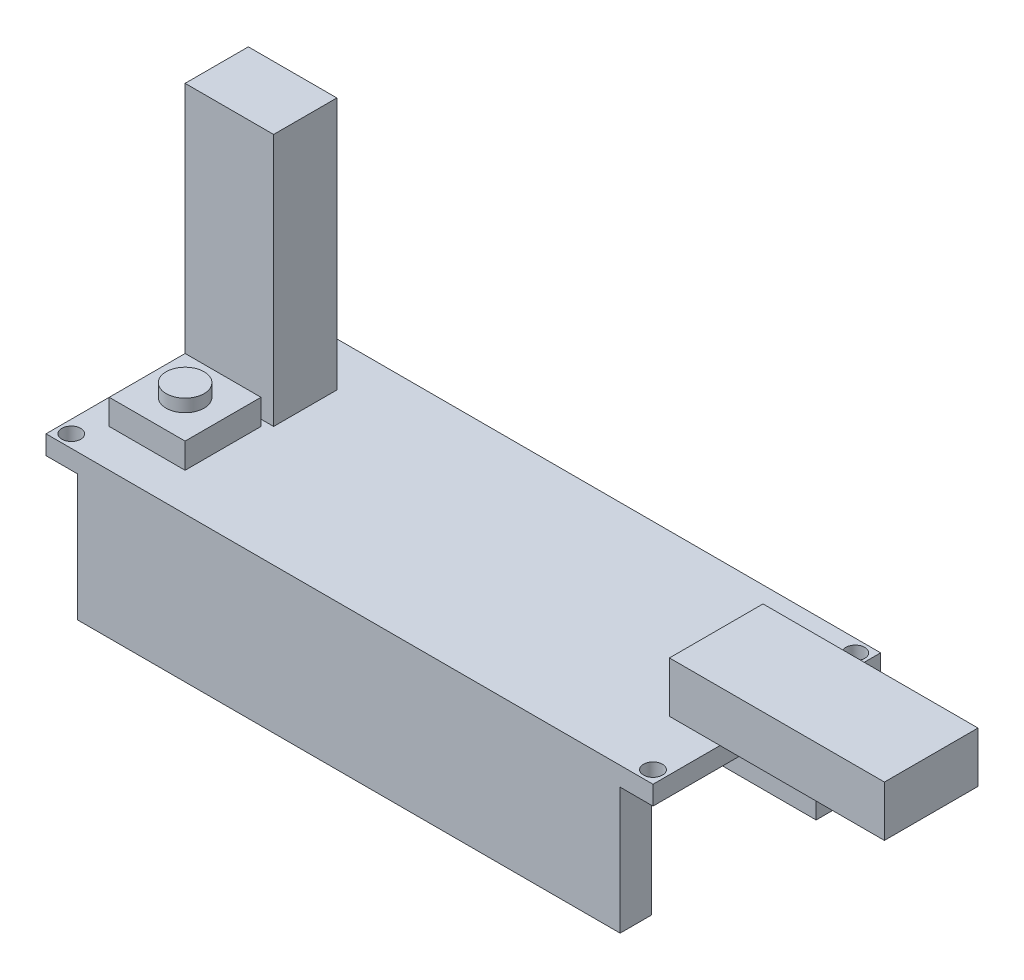
ISO-10303-21;
HEADER;
FILE_DESCRIPTION(('STEP AP214'),'2;1');
FILE_NAME('part.step','',(''),(''),'','','');
FILE_SCHEMA(('AUTOMOTIVE_DESIGN { 1 0 10303 214 1 1 1 1 }'));
ENDSEC;
DATA;
#1=APPLICATION_CONTEXT('core data for automotive mechanical design processes');
#2=APPLICATION_PROTOCOL_DEFINITION('international standard','automotive_design',2000,#1);
#3=PRODUCT_CONTEXT('',#1,'mechanical');
#4=PRODUCT('Part','Part','',(#3));
#5=PRODUCT_RELATED_PRODUCT_CATEGORY('part','',(#4));
#6=PRODUCT_DEFINITION_FORMATION('','',#4);
#7=PRODUCT_DEFINITION_CONTEXT('part definition',#1,'design');
#8=PRODUCT_DEFINITION('design','',#6,#7);
#9=PRODUCT_DEFINITION_SHAPE('','',#8);
#10=(LENGTH_UNIT() NAMED_UNIT(*) SI_UNIT(.MILLI.,.METRE.));
#11=(NAMED_UNIT(*) PLANE_ANGLE_UNIT() SI_UNIT($,.RADIAN.));
#12=(NAMED_UNIT(*) SI_UNIT($,.STERADIAN.) SOLID_ANGLE_UNIT());
#13=UNCERTAINTY_MEASURE_WITH_UNIT(LENGTH_MEASURE(1.E-05),#10,'distance_accuracy_value','');
#14=(GEOMETRIC_REPRESENTATION_CONTEXT(3) GLOBAL_UNCERTAINTY_ASSIGNED_CONTEXT((#13)) GLOBAL_UNIT_ASSIGNED_CONTEXT((#10,
#11,#12)) REPRESENTATION_CONTEXT('',''));
#15=CARTESIAN_POINT('',(0.,0.,0.));
#16=DIRECTION('',(0.,0.,1.));
#17=DIRECTION('',(1.,0.,0.));
#18=AXIS2_PLACEMENT_3D('',#15,#16,#17);
#19=CARTESIAN_POINT('',(0.,3.5,0.));
#20=DIRECTION('',(0.,1.,0.));
#21=DIRECTION('',(0.,0.,1.));
#22=AXIS2_PLACEMENT_3D('',#19,#20,#21);
#23=PLANE('',#22);
#24=DIRECTION('',(-1.,0.,0.));
#25=VECTOR('',#24,1.);
#26=CARTESIAN_POINT('',(0.,3.5,-2.99999999999999));
#27=LINE('',#26,#25);
#28=CARTESIAN_POINT('',(-40.,3.5,-2.99999999999999));
#29=VERTEX_POINT('',#28);
#30=CARTESIAN_POINT('',(-46.,3.5,-2.99999999999999));
#31=VERTEX_POINT('',#30);
#32=EDGE_CURVE('E221',#29,#31,#27,.T.);
#33=ORIENTED_EDGE('',*,*,#32,.F.);
#34=DIRECTION('',(0.,0.,1.));
#35=VECTOR('',#34,1.);
#36=CARTESIAN_POINT('',(-40.,3.5,0.));
#37=LINE('',#36,#35);
#38=CARTESIAN_POINT('',(-40.,3.5,-8.99999999999999));
#39=VERTEX_POINT('',#38);
#40=EDGE_CURVE('E236',#39,#29,#37,.T.);
#41=ORIENTED_EDGE('',*,*,#40,.F.);
#42=DIRECTION('',(1.,0.,0.));
#43=VECTOR('',#42,1.);
#44=CARTESIAN_POINT('',(0.,3.5,-8.99999999999999));
#45=LINE('',#44,#43);
#46=CARTESIAN_POINT('',(-46.,3.5,-8.99999999999999));
#47=VERTEX_POINT('',#46);
#48=EDGE_CURVE('E243',#47,#39,#45,.T.);
#49=ORIENTED_EDGE('',*,*,#48,.F.);
#50=DIRECTION('',(0.,0.,-1.));
#51=VECTOR('',#50,1.);
#52=CARTESIAN_POINT('',(-46.,3.5,0.));
#53=LINE('',#52,#51);
#54=EDGE_CURVE('E239',#31,#47,#53,.T.);
#55=ORIENTED_EDGE('',*,*,#54,.F.);
#56=EDGE_LOOP('',(#33,#41,#49,#55));
#57=FACE_BOUND('',#56,.T.);
#58=CARTESIAN_POINT('',(-43.,3.5,-5.99999999999999));
#59=DIRECTION('',(0.,1.,0.));
#60=DIRECTION('',(0.,0.,1.));
#61=AXIS2_PLACEMENT_3D('',#58,#59,#60);
#62=CIRCLE('',#61,1.5);
#63=CARTESIAN_POINT('',(-43.,3.5,-4.49999999999999));
#64=VERTEX_POINT('',#63);
#65=EDGE_CURVE('E362',#64,#64,#62,.T.);
#66=ORIENTED_EDGE('',*,*,#65,.F.);
#67=EDGE_LOOP('',(#66));
#68=FACE_BOUND('',#67,.T.);
#69=ADVANCED_FACE('F48',(#57,#68),#23,.T.);
#70=CARTESIAN_POINT('',(0.,1.5,0.));
#71=DIRECTION('',(0.,-1.,0.));
#72=DIRECTION('',(0.,0.,-1.));
#73=AXIS2_PLACEMENT_3D('',#70,#71,#72);
#74=PLANE('',#73);
#75=CARTESIAN_POINT('',(-1.,1.5,-17.));
#76=DIRECTION('',(0.,1.,0.));
#77=DIRECTION('',(0.,0.,-1.));
#78=AXIS2_PLACEMENT_3D('',#75,#76,#77);
#79=CIRCLE('',#78,0.749999999999999);
#80=CARTESIAN_POINT('',(-1.,1.5,-17.75));
#81=VERTEX_POINT('',#80);
#82=EDGE_CURVE('E379',#81,#81,#79,.T.);
#83=ORIENTED_EDGE('',*,*,#82,.F.);
#84=EDGE_LOOP('',(#83));
#85=FACE_BOUND('',#84,.T.);
#86=CARTESIAN_POINT('',(-1.,1.5,-0.999999999999994));
#87=DIRECTION('',(0.,1.,0.));
#88=DIRECTION('',(0.,0.,1.));
#89=AXIS2_PLACEMENT_3D('',#86,#87,#88);
#90=CIRCLE('',#89,0.749999999999999);
#91=CARTESIAN_POINT('',(-1.,1.5,-0.249999999999995));
#92=VERTEX_POINT('',#91);
#93=EDGE_CURVE('E369',#92,#92,#90,.T.);
#94=ORIENTED_EDGE('',*,*,#93,.F.);
#95=EDGE_LOOP('',(#94));
#96=FACE_BOUND('',#95,.T.);
#97=CARTESIAN_POINT('',(-47.,1.5,-0.999999999999994));
#98=DIRECTION('',(0.,1.,0.));
#99=DIRECTION('',(0.,0.,-1.));
#100=AXIS2_PLACEMENT_3D('',#97,#98,#99);
#101=CIRCLE('',#100,0.749999999999999);
#102=CARTESIAN_POINT('',(-47.,1.5,-1.74999999999999));
#103=VERTEX_POINT('',#102);
#104=EDGE_CURVE('E366',#103,#103,#101,.T.);
#105=ORIENTED_EDGE('',*,*,#104,.F.);
#106=EDGE_LOOP('',(#105));
#107=FACE_BOUND('',#106,.T.);
#108=CARTESIAN_POINT('',(-47.,1.5,-17.));
#109=DIRECTION('',(0.,1.,0.));
#110=DIRECTION('',(0.,0.,1.));
#111=AXIS2_PLACEMENT_3D('',#108,#109,#110);
#112=CIRCLE('',#111,0.749999999999999);
#113=CARTESIAN_POINT('',(-47.,1.5,-16.25));
#114=VERTEX_POINT('',#113);
#115=EDGE_CURVE('E363',#114,#114,#112,.T.);
#116=ORIENTED_EDGE('',*,*,#115,.F.);
#117=EDGE_LOOP('',(#116));
#118=FACE_BOUND('',#117,.T.);
#119=DIRECTION('',(0.,0.,1.));
#120=VECTOR('',#119,1.);
#121=CARTESIAN_POINT('',(-40.,1.5,0.));
#122=LINE('',#121,#120);
#123=CARTESIAN_POINT('',(-40.,1.5,-8.99999999999999));
#124=VERTEX_POINT('',#123);
#125=CARTESIAN_POINT('',(-40.,1.5,-2.99999999999999));
#126=VERTEX_POINT('',#125);
#127=EDGE_CURVE('E251',#124,#126,#122,.T.);
#128=ORIENTED_EDGE('',*,*,#127,.T.);
#129=DIRECTION('',(-1.,0.,0.));
#130=VECTOR('',#129,1.);
#131=CARTESIAN_POINT('',(0.,1.5,-2.99999999999999));
#132=LINE('',#131,#130);
#133=CARTESIAN_POINT('',(-46.,1.5,-2.99999999999999));
#134=VERTEX_POINT('',#133);
#135=EDGE_CURVE('E224',#126,#134,#132,.T.);
#136=ORIENTED_EDGE('',*,*,#135,.T.);
#137=DIRECTION('',(0.,0.,-1.));
#138=VECTOR('',#137,1.);
#139=CARTESIAN_POINT('',(-46.,1.5,0.));
#140=LINE('',#139,#138);
#141=CARTESIAN_POINT('',(-46.,1.5,-8.99999999999999));
#142=VERTEX_POINT('',#141);
#143=EDGE_CURVE('E240',#134,#142,#140,.T.);
#144=ORIENTED_EDGE('',*,*,#143,.T.);
#145=DIRECTION('',(1.,0.,0.));
#146=VECTOR('',#145,1.);
#147=CARTESIAN_POINT('',(0.,1.5,-8.99999999999999));
#148=LINE('',#147,#146);
#149=EDGE_CURVE('E66',#142,#124,#148,.T.);
#150=ORIENTED_EDGE('',*,*,#149,.T.);
#151=EDGE_LOOP('',(#128,#136,#144,#150));
#152=FACE_BOUND('',#151,.T.);
#153=DIRECTION('',(0.,0.,-1.));
#154=VECTOR('',#153,1.);
#155=CARTESIAN_POINT('',(-46.5,1.5,0.));
#156=LINE('',#155,#154);
#157=CARTESIAN_POINT('',(-46.5,1.5,-9.49999999999999));
#158=VERTEX_POINT('',#157);
#159=CARTESIAN_POINT('',(-46.5,1.5,-14.5));
#160=VERTEX_POINT('',#159);
#161=EDGE_CURVE('E277',#158,#160,#156,.T.);
#162=ORIENTED_EDGE('',*,*,#161,.T.);
#163=DIRECTION('',(1.,0.,0.));
#164=VECTOR('',#163,1.);
#165=CARTESIAN_POINT('',(0.,1.5,-14.5));
#166=LINE('',#165,#164);
#167=CARTESIAN_POINT('',(-39.5,1.5,-14.5));
#168=VERTEX_POINT('',#167);
#169=EDGE_CURVE('E229',#160,#168,#166,.T.);
#170=ORIENTED_EDGE('',*,*,#169,.T.);
#171=DIRECTION('',(0.,0.,1.));
#172=VECTOR('',#171,1.);
#173=CARTESIAN_POINT('',(-39.5,1.5,0.));
#174=LINE('',#173,#172);
#175=CARTESIAN_POINT('',(-39.5,1.5,-9.49999999999999));
#176=VERTEX_POINT('',#175);
#177=EDGE_CURVE('E265',#168,#176,#174,.T.);
#178=ORIENTED_EDGE('',*,*,#177,.T.);
#179=DIRECTION('',(-1.,0.,0.));
#180=VECTOR('',#179,1.);
#181=CARTESIAN_POINT('',(0.,1.5,-9.49999999999999));
#182=LINE('',#181,#180);
#183=EDGE_CURVE('E74',#176,#158,#182,.T.);
#184=ORIENTED_EDGE('',*,*,#183,.T.);
#185=EDGE_LOOP('',(#162,#170,#178,#184));
#186=FACE_BOUND('',#185,.T.);
#187=DIRECTION('',(1.,0.,0.));
#188=VECTOR('',#187,1.);
#189=CARTESIAN_POINT('',(0.,1.5,-5.3));
#190=LINE('',#189,#188);
#191=CARTESIAN_POINT('',(-4.,1.5,-5.3));
#192=VERTEX_POINT('',#191);
#193=CARTESIAN_POINT('',(0.,1.5,-5.3));
#194=VERTEX_POINT('',#193);
#195=EDGE_CURVE('E584',#192,#194,#190,.T.);
#196=ORIENTED_EDGE('',*,*,#195,.F.);
#197=DIRECTION('',(0.,0.,1.));
#198=VECTOR('',#197,1.);
#199=CARTESIAN_POINT('',(-4.,1.5,0.));
#200=LINE('',#199,#198);
#201=CARTESIAN_POINT('',(-4.,1.5,-12.7));
#202=VERTEX_POINT('',#201);
#203=EDGE_CURVE('E589',#202,#192,#200,.T.);
#204=ORIENTED_EDGE('',*,*,#203,.F.);
#205=DIRECTION('',(-1.,0.,0.));
#206=VECTOR('',#205,1.);
#207=CARTESIAN_POINT('',(0.,1.5,-12.7));
#208=LINE('',#207,#206);
#209=CARTESIAN_POINT('',(0.,1.5,-12.7));
#210=VERTEX_POINT('',#209);
#211=EDGE_CURVE('E12',#210,#202,#208,.T.);
#212=ORIENTED_EDGE('',*,*,#211,.F.);
#213=DIRECTION('',(0.,0.,-1.));
#214=VECTOR('',#213,1.);
#215=CARTESIAN_POINT('',(0.,1.5,-18.));
#216=LINE('',#215,#214);
#217=CARTESIAN_POINT('',(0.,1.5,-18.));
#218=VERTEX_POINT('',#217);
#219=EDGE_CURVE('E551',#210,#218,#216,.T.);
#220=ORIENTED_EDGE('',*,*,#219,.T.);
#221=DIRECTION('',(-1.,0.,0.));
#222=VECTOR('',#221,1.);
#223=CARTESIAN_POINT('',(-48.,1.5,-18.));
#224=LINE('',#223,#222);
#225=CARTESIAN_POINT('',(-48.,1.5,-18.));
#226=VERTEX_POINT('',#225);
#227=EDGE_CURVE('E572',#218,#226,#224,.T.);
#228=ORIENTED_EDGE('',*,*,#227,.T.);
#229=DIRECTION('',(0.,0.,1.));
#230=VECTOR('',#229,1.);
#231=CARTESIAN_POINT('',(-48.,1.5,0.));
#232=LINE('',#231,#230);
#233=CARTESIAN_POINT('',(-48.,1.5,0.));
#234=VERTEX_POINT('',#233);
#235=EDGE_CURVE('E571',#226,#234,#232,.T.);
#236=ORIENTED_EDGE('',*,*,#235,.T.);
#237=DIRECTION('',(1.,0.,0.));
#238=VECTOR('',#237,1.);
#239=CARTESIAN_POINT('',(0.,1.5,0.));
#240=LINE('',#239,#238);
#241=CARTESIAN_POINT('',(0.,1.5,0.));
#242=VERTEX_POINT('',#241);
#243=EDGE_CURVE('E535',#234,#242,#240,.T.);
#244=ORIENTED_EDGE('',*,*,#243,.T.);
#245=EDGE_CURVE('E556',#242,#194,#216,.T.);
#246=ORIENTED_EDGE('',*,*,#245,.T.);
#247=EDGE_LOOP('',(#196,#204,#212,#220,#228,#236,#244,#246));
#248=FACE_BOUND('',#247,.T.);
#249=ADVANCED_FACE('F391',(#85,#96,#107,#118,#152,#186,#248),#74,.F.);
#250=CARTESIAN_POINT('',(0.,1.5,-18.));
#251=DIRECTION('',(-1.,0.,0.));
#252=DIRECTION('',(0.,0.,1.));
#253=AXIS2_PLACEMENT_3D('',#250,#251,#252);
#254=PLANE('',#253);
#255=DIRECTION('',(0.,0.,-1.));
#256=VECTOR('',#255,1.);
#257=CARTESIAN_POINT('',(0.,0.,-18.));
#258=LINE('',#257,#256);
#259=CARTESIAN_POINT('',(0.,0.,0.));
#260=VERTEX_POINT('',#259);
#261=CARTESIAN_POINT('',(0.,0.,-18.));
#262=VERTEX_POINT('',#261);
#263=EDGE_CURVE('E527',#260,#262,#258,.T.);
#264=ORIENTED_EDGE('',*,*,#263,.T.);
#265=DIRECTION('',(0.,-1.,0.));
#266=VECTOR('',#265,1.);
#267=CARTESIAN_POINT('',(0.,1.5,-18.));
#268=LINE('',#267,#266);
#269=EDGE_CURVE('E57',#218,#262,#268,.T.);
#270=ORIENTED_EDGE('',*,*,#269,.F.);
#271=ORIENTED_EDGE('',*,*,#219,.F.);
#272=EDGE_CURVE('E554',#194,#210,#216,.T.);
#273=ORIENTED_EDGE('',*,*,#272,.F.);
#274=ORIENTED_EDGE('',*,*,#245,.F.);
#275=DIRECTION('',(0.,-1.,0.));
#276=VECTOR('',#275,1.);
#277=CARTESIAN_POINT('',(0.,1.5,0.));
#278=LINE('',#277,#276);
#279=EDGE_CURVE('E548',#242,#260,#278,.T.);
#280=ORIENTED_EDGE('',*,*,#279,.T.);
#281=EDGE_LOOP('',(#264,#270,#271,#273,#274,#280));
#282=FACE_BOUND('',#281,.T.);
#283=ADVANCED_FACE('F50',(#282),#254,.F.);
#284=CARTESIAN_POINT('',(-48.,1.5,-18.));
#285=DIRECTION('',(0.,0.,1.));
#286=DIRECTION('',(1.,0.,0.));
#287=AXIS2_PLACEMENT_3D('',#284,#285,#286);
#288=PLANE('',#287);
#289=DIRECTION('',(-1.,0.,0.));
#290=VECTOR('',#289,1.);
#291=CARTESIAN_POINT('',(-48.,0.,-18.));
#292=LINE('',#291,#290);
#293=CARTESIAN_POINT('',(-2.6,0.,-18.));
#294=VERTEX_POINT('',#293);
#295=EDGE_CURVE('E508',#262,#294,#292,.T.);
#296=ORIENTED_EDGE('',*,*,#295,.T.);
#297=DIRECTION('',(0.,1.,0.));
#298=VECTOR('',#297,1.);
#299=CARTESIAN_POINT('',(-2.6,-10.,-18.));
#300=LINE('',#299,#298);
#301=CARTESIAN_POINT('',(-2.6,-10.,-18.));
#302=VERTEX_POINT('',#301);
#303=EDGE_CURVE('E348',#302,#294,#300,.T.);
#304=ORIENTED_EDGE('',*,*,#303,.F.);
#305=DIRECTION('',(1.,0.,0.));
#306=VECTOR('',#305,1.);
#307=CARTESIAN_POINT('',(0.,-10.,-18.));
#308=LINE('',#307,#306);
#309=CARTESIAN_POINT('',(-45.5,-10.,-18.));
#310=VERTEX_POINT('',#309);
#311=EDGE_CURVE('E326',#310,#302,#308,.T.);
#312=ORIENTED_EDGE('',*,*,#311,.F.);
#313=DIRECTION('',(0.,1.,0.));
#314=VECTOR('',#313,1.);
#315=CARTESIAN_POINT('',(-45.5,-10.,-18.));
#316=LINE('',#315,#314);
#317=CARTESIAN_POINT('',(-45.5,0.,-18.));
#318=VERTEX_POINT('',#317);
#319=EDGE_CURVE('E344',#310,#318,#316,.T.);
#320=ORIENTED_EDGE('',*,*,#319,.T.);
#321=CARTESIAN_POINT('',(-48.,0.,-18.));
#322=VERTEX_POINT('',#321);
#323=EDGE_CURVE('E341',#318,#322,#292,.T.);
#324=ORIENTED_EDGE('',*,*,#323,.T.);
#325=DIRECTION('',(0.,-1.,0.));
#326=VECTOR('',#325,1.);
#327=CARTESIAN_POINT('',(-48.,1.5,-18.));
#328=LINE('',#327,#326);
#329=EDGE_CURVE('E543',#226,#322,#328,.T.);
#330=ORIENTED_EDGE('',*,*,#329,.F.);
#331=ORIENTED_EDGE('',*,*,#227,.F.);
#332=ORIENTED_EDGE('',*,*,#269,.T.);
#333=EDGE_LOOP('',(#296,#304,#312,#320,#324,#330,#331,#332));
#334=FACE_BOUND('',#333,.T.);
#335=ADVANCED_FACE('F497',(#334),#288,.F.);
#336=CARTESIAN_POINT('',(-48.,1.5,0.));
#337=DIRECTION('',(1.,0.,0.));
#338=DIRECTION('',(0.,0.,-1.));
#339=AXIS2_PLACEMENT_3D('',#336,#337,#338);
#340=PLANE('',#339);
#341=DIRECTION('',(0.,0.,1.));
#342=VECTOR('',#341,1.);
#343=CARTESIAN_POINT('',(-48.,0.,0.));
#344=LINE('',#343,#342);
#345=CARTESIAN_POINT('',(-48.,0.,0.));
#346=VERTEX_POINT('',#345);
#347=EDGE_CURVE('E516',#322,#346,#344,.T.);
#348=ORIENTED_EDGE('',*,*,#347,.T.);
#349=DIRECTION('',(0.,-1.,0.));
#350=VECTOR('',#349,1.);
#351=CARTESIAN_POINT('',(-48.,1.5,0.));
#352=LINE('',#351,#350);
#353=EDGE_CURVE('E545',#234,#346,#352,.T.);
#354=ORIENTED_EDGE('',*,*,#353,.F.);
#355=ORIENTED_EDGE('',*,*,#235,.F.);
#356=ORIENTED_EDGE('',*,*,#329,.T.);
#357=EDGE_LOOP('',(#348,#354,#355,#356));
#358=FACE_BOUND('',#357,.T.);
#359=ADVANCED_FACE('F494',(#358),#340,.F.);
#360=CARTESIAN_POINT('',(0.,1.5,0.));
#361=DIRECTION('',(0.,0.,-1.));
#362=DIRECTION('',(-1.,0.,0.));
#363=AXIS2_PLACEMENT_3D('',#360,#361,#362);
#364=PLANE('',#363);
#365=DIRECTION('',(1.,0.,0.));
#366=VECTOR('',#365,1.);
#367=CARTESIAN_POINT('',(0.,0.,0.));
#368=LINE('',#367,#366);
#369=CARTESIAN_POINT('',(-45.5,0.,0.));
#370=VERTEX_POINT('',#369);
#371=EDGE_CURVE('E549',#346,#370,#368,.T.);
#372=ORIENTED_EDGE('',*,*,#371,.T.);
#373=DIRECTION('',(0.,1.,0.));
#374=VECTOR('',#373,1.);
#375=CARTESIAN_POINT('',(-45.5,-10.,0.));
#376=LINE('',#375,#374);
#377=CARTESIAN_POINT('',(-45.5,-10.,0.));
#378=VERTEX_POINT('',#377);
#379=EDGE_CURVE('E313',#378,#370,#376,.T.);
#380=ORIENTED_EDGE('',*,*,#379,.F.);
#381=DIRECTION('',(-1.,0.,0.));
#382=VECTOR('',#381,1.);
#383=CARTESIAN_POINT('',(0.,-10.,0.));
#384=LINE('',#383,#382);
#385=CARTESIAN_POINT('',(-2.6,-10.,0.));
#386=VERTEX_POINT('',#385);
#387=EDGE_CURVE('E294',#386,#378,#384,.T.);
#388=ORIENTED_EDGE('',*,*,#387,.F.);
#389=DIRECTION('',(0.,1.,0.));
#390=VECTOR('',#389,1.);
#391=CARTESIAN_POINT('',(-2.6,-10.,0.));
#392=LINE('',#391,#390);
#393=CARTESIAN_POINT('',(-2.6,0.,0.));
#394=VERTEX_POINT('',#393);
#395=EDGE_CURVE('E316',#386,#394,#392,.T.);
#396=ORIENTED_EDGE('',*,*,#395,.T.);
#397=EDGE_CURVE('E552',#394,#260,#368,.T.);
#398=ORIENTED_EDGE('',*,*,#397,.T.);
#399=ORIENTED_EDGE('',*,*,#279,.F.);
#400=ORIENTED_EDGE('',*,*,#243,.F.);
#401=ORIENTED_EDGE('',*,*,#353,.T.);
#402=EDGE_LOOP('',(#372,#380,#388,#396,#398,#399,#400,#401));
#403=FACE_BOUND('',#402,.T.);
#404=ADVANCED_FACE('F490',(#403),#364,.F.);
#405=CARTESIAN_POINT('',(0.,0.,0.));
#406=DIRECTION('',(0.,-1.,0.));
#407=DIRECTION('',(0.,0.,-1.));
#408=AXIS2_PLACEMENT_3D('',#405,#406,#407);
#409=PLANE('',#408);
#410=CARTESIAN_POINT('',(-1.,0.,-17.));
#411=DIRECTION('',(0.,-1.,0.));
#412=DIRECTION('',(0.,0.,-1.));
#413=AXIS2_PLACEMENT_3D('',#410,#411,#412);
#414=CIRCLE('',#413,0.749999999999999);
#415=CARTESIAN_POINT('',(-1.,0.,-17.75));
#416=VERTEX_POINT('',#415);
#417=EDGE_CURVE('E52',#416,#416,#414,.T.);
#418=ORIENTED_EDGE('',*,*,#417,.F.);
#419=EDGE_LOOP('',(#418));
#420=FACE_BOUND('',#419,.T.);
#421=CARTESIAN_POINT('',(-1.,0.,-0.999999999999994));
#422=DIRECTION('',(0.,-1.,0.));
#423=DIRECTION('',(0.,0.,-1.));
#424=AXIS2_PLACEMENT_3D('',#421,#422,#423);
#425=CIRCLE('',#424,0.749999999999999);
#426=CARTESIAN_POINT('',(-1.,0.,-1.74999999999999));
#427=VERTEX_POINT('',#426);
#428=EDGE_CURVE('E367',#427,#427,#425,.T.);
#429=ORIENTED_EDGE('',*,*,#428,.F.);
#430=EDGE_LOOP('',(#429));
#431=FACE_BOUND('',#430,.T.);
#432=CARTESIAN_POINT('',(-47.,0.,-0.999999999999994));
#433=DIRECTION('',(0.,-1.,0.));
#434=DIRECTION('',(0.,0.,-1.));
#435=AXIS2_PLACEMENT_3D('',#432,#433,#434);
#436=CIRCLE('',#435,0.749999999999999);
#437=CARTESIAN_POINT('',(-47.,0.,-1.74999999999999));
#438=VERTEX_POINT('',#437);
#439=EDGE_CURVE('E364',#438,#438,#436,.T.);
#440=ORIENTED_EDGE('',*,*,#439,.F.);
#441=EDGE_LOOP('',(#440));
#442=FACE_BOUND('',#441,.T.);
#443=CARTESIAN_POINT('',(-47.,0.,-17.));
#444=DIRECTION('',(0.,-1.,0.));
#445=DIRECTION('',(0.,0.,-1.));
#446=AXIS2_PLACEMENT_3D('',#443,#444,#445);
#447=CIRCLE('',#446,0.749999999999999);
#448=CARTESIAN_POINT('',(-47.,0.,-17.75));
#449=VERTEX_POINT('',#448);
#450=EDGE_CURVE('E359',#449,#449,#447,.T.);
#451=ORIENTED_EDGE('',*,*,#450,.F.);
#452=EDGE_LOOP('',(#451));
#453=FACE_BOUND('',#452,.T.);
#454=DIRECTION('',(0.,0.,-1.));
#455=VECTOR('',#454,1.);
#456=CARTESIAN_POINT('',(-2.6,0.,0.));
#457=LINE('',#456,#455);
#458=CARTESIAN_POINT('',(-2.6,0.,-2.5));
#459=VERTEX_POINT('',#458);
#460=EDGE_CURVE('E290',#394,#459,#457,.T.);
#461=ORIENTED_EDGE('',*,*,#460,.T.);
#462=DIRECTION('',(-1.,0.,0.));
#463=VECTOR('',#462,1.);
#464=CARTESIAN_POINT('',(0.,0.,-2.5));
#465=LINE('',#464,#463);
#466=CARTESIAN_POINT('',(-45.5,0.,-2.49999999999999));
#467=VERTEX_POINT('',#466);
#468=EDGE_CURVE('E295',#459,#467,#465,.T.);
#469=ORIENTED_EDGE('',*,*,#468,.T.);
#470=DIRECTION('',(0.,0.,1.));
#471=VECTOR('',#470,1.);
#472=CARTESIAN_POINT('',(-45.5,0.,0.));
#473=LINE('',#472,#471);
#474=EDGE_CURVE('E305',#467,#370,#473,.T.);
#475=ORIENTED_EDGE('',*,*,#474,.T.);
#476=ORIENTED_EDGE('',*,*,#371,.F.);
#477=ORIENTED_EDGE('',*,*,#347,.F.);
#478=ORIENTED_EDGE('',*,*,#323,.F.);
#479=DIRECTION('',(0.,0.,-1.));
#480=VECTOR('',#479,1.);
#481=CARTESIAN_POINT('',(-45.5,0.,0.));
#482=LINE('',#481,#480);
#483=CARTESIAN_POINT('',(-45.5,0.,-15.5));
#484=VERTEX_POINT('',#483);
#485=EDGE_CURVE('E333',#484,#318,#482,.T.);
#486=ORIENTED_EDGE('',*,*,#485,.F.);
#487=DIRECTION('',(-1.,0.,0.));
#488=VECTOR('',#487,1.);
#489=CARTESIAN_POINT('',(0.,0.,-15.5));
#490=LINE('',#489,#488);
#491=CARTESIAN_POINT('',(-2.6,0.,-15.5));
#492=VERTEX_POINT('',#491);
#493=EDGE_CURVE('E319',#492,#484,#490,.T.);
#494=ORIENTED_EDGE('',*,*,#493,.F.);
#495=DIRECTION('',(0.,0.,1.));
#496=VECTOR('',#495,1.);
#497=CARTESIAN_POINT('',(-2.6,0.,0.));
#498=LINE('',#497,#496);
#499=EDGE_CURVE('E324',#294,#492,#498,.T.);
#500=ORIENTED_EDGE('',*,*,#499,.F.);
#501=ORIENTED_EDGE('',*,*,#295,.F.);
#502=ORIENTED_EDGE('',*,*,#263,.F.);
#503=ORIENTED_EDGE('',*,*,#397,.F.);
#504=EDGE_LOOP('',(#461,#469,#475,#476,#477,#478,#486,#494,#500,#501,#502,#503));
#505=FACE_BOUND('',#504,.T.);
#506=ADVANCED_FACE('F472',(#420,#431,#442,#453,#505),#409,.T.);
#507=CARTESIAN_POINT('',(0.,1.5,0.));
#508=DIRECTION('',(0.,1.,0.));
#509=DIRECTION('',(0.,0.,1.));
#510=AXIS2_PLACEMENT_3D('',#507,#508,#509);
#511=PLANE('',#510);
#512=CARTESIAN_POINT('',(13.,1.5,-5.3));
#513=VERTEX_POINT('',#512);
#514=EDGE_CURVE('E588',#194,#513,#190,.T.);
#515=ORIENTED_EDGE('',*,*,#514,.F.);
#516=ORIENTED_EDGE('',*,*,#272,.T.);
#517=CARTESIAN_POINT('',(13.,1.5,-12.7));
#518=VERTEX_POINT('',#517);
#519=EDGE_CURVE('E59',#518,#210,#208,.T.);
#520=ORIENTED_EDGE('',*,*,#519,.F.);
#521=DIRECTION('',(0.,0.,-1.));
#522=VECTOR('',#521,1.);
#523=CARTESIAN_POINT('',(13.,1.5,0.));
#524=LINE('',#523,#522);
#525=EDGE_CURVE('E593',#513,#518,#524,.T.);
#526=ORIENTED_EDGE('',*,*,#525,.F.);
#527=EDGE_LOOP('',(#515,#516,#520,#526));
#528=FACE_BOUND('',#527,.T.);
#529=ADVANCED_FACE('F468',(#528),#511,.F.);
#530=CARTESIAN_POINT('',(13.,5.5,0.));
#531=DIRECTION('',(-1.,0.,0.));
#532=DIRECTION('',(0.,0.,1.));
#533=AXIS2_PLACEMENT_3D('',#530,#531,#532);
#534=PLANE('',#533);
#535=ORIENTED_EDGE('',*,*,#525,.T.);
#536=DIRECTION('',(0.,-1.,0.));
#537=VECTOR('',#536,1.);
#538=CARTESIAN_POINT('',(13.,5.5,-12.7));
#539=LINE('',#538,#537);
#540=CARTESIAN_POINT('',(13.,5.5,-12.7));
#541=VERTEX_POINT('',#540);
#542=EDGE_CURVE('E528',#541,#518,#539,.T.);
#543=ORIENTED_EDGE('',*,*,#542,.F.);
#544=DIRECTION('',(0.,0.,-1.));
#545=VECTOR('',#544,1.);
#546=CARTESIAN_POINT('',(13.,5.5,0.));
#547=LINE('',#546,#545);
#548=CARTESIAN_POINT('',(13.,5.5,-5.3));
#549=VERTEX_POINT('',#548);
#550=EDGE_CURVE('E587',#549,#541,#547,.T.);
#551=ORIENTED_EDGE('',*,*,#550,.F.);
#552=DIRECTION('',(0.,-1.,0.));
#553=VECTOR('',#552,1.);
#554=CARTESIAN_POINT('',(13.,5.5,-5.3));
#555=LINE('',#554,#553);
#556=EDGE_CURVE('E580',#549,#513,#555,.T.);
#557=ORIENTED_EDGE('',*,*,#556,.T.);
#558=EDGE_LOOP('',(#535,#543,#551,#557));
#559=FACE_BOUND('',#558,.T.);
#560=ADVANCED_FACE('F471',(#559),#534,.F.);
#561=CARTESIAN_POINT('',(0.,5.5,-12.7));
#562=DIRECTION('',(0.,0.,1.));
#563=DIRECTION('',(1.,0.,0.));
#564=AXIS2_PLACEMENT_3D('',#561,#562,#563);
#565=PLANE('',#564);
#566=ORIENTED_EDGE('',*,*,#519,.T.);
#567=ORIENTED_EDGE('',*,*,#211,.T.);
#568=DIRECTION('',(0.,-1.,0.));
#569=VECTOR('',#568,1.);
#570=CARTESIAN_POINT('',(-4.,5.5,-12.7));
#571=LINE('',#570,#569);
#572=CARTESIAN_POINT('',(-4.,5.5,-12.7));
#573=VERTEX_POINT('',#572);
#574=EDGE_CURVE('E532',#573,#202,#571,.T.);
#575=ORIENTED_EDGE('',*,*,#574,.F.);
#576=DIRECTION('',(-1.,0.,0.));
#577=VECTOR('',#576,1.);
#578=CARTESIAN_POINT('',(0.,5.5,-12.7));
#579=LINE('',#578,#577);
#580=EDGE_CURVE('E599',#541,#573,#579,.T.);
#581=ORIENTED_EDGE('',*,*,#580,.F.);
#582=ORIENTED_EDGE('',*,*,#542,.T.);
#583=EDGE_LOOP('',(#566,#567,#575,#581,#582));
#584=FACE_BOUND('',#583,.T.);
#585=ADVANCED_FACE('F480',(#584),#565,.F.);
#586=CARTESIAN_POINT('',(-4.,5.5,0.));
#587=DIRECTION('',(1.,0.,0.));
#588=DIRECTION('',(0.,0.,-1.));
#589=AXIS2_PLACEMENT_3D('',#586,#587,#588);
#590=PLANE('',#589);
#591=ORIENTED_EDGE('',*,*,#203,.T.);
#592=DIRECTION('',(0.,-1.,0.));
#593=VECTOR('',#592,1.);
#594=CARTESIAN_POINT('',(-4.,5.5,-5.3));
#595=LINE('',#594,#593);
#596=CARTESIAN_POINT('',(-4.,5.5,-5.3));
#597=VERTEX_POINT('',#596);
#598=EDGE_CURVE('E577',#597,#192,#595,.T.);
#599=ORIENTED_EDGE('',*,*,#598,.F.);
#600=DIRECTION('',(0.,0.,1.));
#601=VECTOR('',#600,1.);
#602=CARTESIAN_POINT('',(-4.,5.5,0.));
#603=LINE('',#602,#601);
#604=EDGE_CURVE('E597',#573,#597,#603,.T.);
#605=ORIENTED_EDGE('',*,*,#604,.F.);
#606=ORIENTED_EDGE('',*,*,#574,.T.);
#607=EDGE_LOOP('',(#591,#599,#605,#606));
#608=FACE_BOUND('',#607,.T.);
#609=ADVANCED_FACE('F476',(#608),#590,.F.);
#610=CARTESIAN_POINT('',(0.,5.5,-5.3));
#611=DIRECTION('',(0.,0.,-1.));
#612=DIRECTION('',(-1.,0.,0.));
#613=AXIS2_PLACEMENT_3D('',#610,#611,#612);
#614=PLANE('',#613);
#615=ORIENTED_EDGE('',*,*,#195,.T.);
#616=ORIENTED_EDGE('',*,*,#514,.T.);
#617=ORIENTED_EDGE('',*,*,#556,.F.);
#618=DIRECTION('',(1.,0.,0.));
#619=VECTOR('',#618,1.);
#620=CARTESIAN_POINT('',(0.,5.5,-5.3));
#621=LINE('',#620,#619);
#622=EDGE_CURVE('E583',#597,#549,#621,.T.);
#623=ORIENTED_EDGE('',*,*,#622,.F.);
#624=ORIENTED_EDGE('',*,*,#598,.T.);
#625=EDGE_LOOP('',(#615,#616,#617,#623,#624));
#626=FACE_BOUND('',#625,.T.);
#627=ADVANCED_FACE('F466',(#626),#614,.F.);
#628=CARTESIAN_POINT('',(0.,5.5,0.));
#629=DIRECTION('',(0.,1.,0.));
#630=DIRECTION('',(0.,0.,1.));
#631=AXIS2_PLACEMENT_3D('',#628,#629,#630);
#632=PLANE('',#631);
#633=ORIENTED_EDGE('',*,*,#550,.T.);
#634=ORIENTED_EDGE('',*,*,#580,.T.);
#635=ORIENTED_EDGE('',*,*,#604,.T.);
#636=ORIENTED_EDGE('',*,*,#622,.T.);
#637=EDGE_LOOP('',(#633,#634,#635,#636));
#638=FACE_BOUND('',#637,.T.);
#639=ADVANCED_FACE('F462',(#638),#632,.T.);
#640=CARTESIAN_POINT('',(0.,-10.,-15.5));
#641=DIRECTION('',(0.,0.,-1.));
#642=DIRECTION('',(-1.,0.,0.));
#643=AXIS2_PLACEMENT_3D('',#640,#641,#642);
#644=PLANE('',#643);
#645=ORIENTED_EDGE('',*,*,#493,.T.);
#646=DIRECTION('',(0.,1.,0.));
#647=VECTOR('',#646,1.);
#648=CARTESIAN_POINT('',(-45.5,-10.,-15.5));
#649=LINE('',#648,#647);
#650=CARTESIAN_POINT('',(-45.5,-10.,-15.5));
#651=VERTEX_POINT('',#650);
#652=EDGE_CURVE('E347',#651,#484,#649,.T.);
#653=ORIENTED_EDGE('',*,*,#652,.F.);
#654=DIRECTION('',(-1.,0.,0.));
#655=VECTOR('',#654,1.);
#656=CARTESIAN_POINT('',(0.,-10.,-15.5));
#657=LINE('',#656,#655);
#658=CARTESIAN_POINT('',(-2.6,-10.,-15.5));
#659=VERTEX_POINT('',#658);
#660=EDGE_CURVE('E320',#659,#651,#657,.T.);
#661=ORIENTED_EDGE('',*,*,#660,.F.);
#662=DIRECTION('',(0.,1.,0.));
#663=VECTOR('',#662,1.);
#664=CARTESIAN_POINT('',(-2.6,-10.,-15.5));
#665=LINE('',#664,#663);
#666=EDGE_CURVE('E330',#659,#492,#665,.T.);
#667=ORIENTED_EDGE('',*,*,#666,.T.);
#668=EDGE_LOOP('',(#645,#653,#661,#667));
#669=FACE_BOUND('',#668,.T.);
#670=ADVANCED_FACE('F458',(#669),#644,.F.);
#671=CARTESIAN_POINT('',(-45.5,-10.,0.));
#672=DIRECTION('',(1.,0.,0.));
#673=DIRECTION('',(0.,0.,-1.));
#674=AXIS2_PLACEMENT_3D('',#671,#672,#673);
#675=PLANE('',#674);
#676=ORIENTED_EDGE('',*,*,#485,.T.);
#677=ORIENTED_EDGE('',*,*,#319,.F.);
#678=DIRECTION('',(0.,0.,-1.));
#679=VECTOR('',#678,1.);
#680=CARTESIAN_POINT('',(-45.5,-10.,0.));
#681=LINE('',#680,#679);
#682=EDGE_CURVE('E323',#651,#310,#681,.T.);
#683=ORIENTED_EDGE('',*,*,#682,.F.);
#684=ORIENTED_EDGE('',*,*,#652,.T.);
#685=EDGE_LOOP('',(#676,#677,#683,#684));
#686=FACE_BOUND('',#685,.T.);
#687=ADVANCED_FACE('F454',(#686),#675,.F.);
#688=CARTESIAN_POINT('',(-2.6,-10.,0.));
#689=DIRECTION('',(-1.,0.,0.));
#690=DIRECTION('',(0.,0.,1.));
#691=AXIS2_PLACEMENT_3D('',#688,#689,#690);
#692=PLANE('',#691);
#693=ORIENTED_EDGE('',*,*,#499,.T.);
#694=ORIENTED_EDGE('',*,*,#666,.F.);
#695=DIRECTION('',(0.,0.,1.));
#696=VECTOR('',#695,1.);
#697=CARTESIAN_POINT('',(-2.6,-10.,0.));
#698=LINE('',#697,#696);
#699=EDGE_CURVE('E328',#302,#659,#698,.T.);
#700=ORIENTED_EDGE('',*,*,#699,.F.);
#701=ORIENTED_EDGE('',*,*,#303,.T.);
#702=EDGE_LOOP('',(#693,#694,#700,#701));
#703=FACE_BOUND('',#702,.T.);
#704=ADVANCED_FACE('F450',(#703),#692,.F.);
#705=CARTESIAN_POINT('',(0.,-10.,0.));
#706=DIRECTION('',(0.,-1.,0.));
#707=DIRECTION('',(0.,0.,-1.));
#708=AXIS2_PLACEMENT_3D('',#705,#706,#707);
#709=PLANE('',#708);
#710=ORIENTED_EDGE('',*,*,#660,.T.);
#711=ORIENTED_EDGE('',*,*,#682,.T.);
#712=ORIENTED_EDGE('',*,*,#311,.T.);
#713=ORIENTED_EDGE('',*,*,#699,.T.);
#714=EDGE_LOOP('',(#710,#711,#712,#713));
#715=FACE_BOUND('',#714,.T.);
#716=ADVANCED_FACE('F446',(#715),#709,.T.);
#717=CARTESIAN_POINT('',(-2.6,-10.,0.));
#718=DIRECTION('',(1.,0.,0.));
#719=DIRECTION('',(0.,0.,-1.));
#720=AXIS2_PLACEMENT_3D('',#717,#718,#719);
#721=PLANE('',#720);
#722=ORIENTED_EDGE('',*,*,#460,.F.);
#723=ORIENTED_EDGE('',*,*,#395,.F.);
#724=DIRECTION('',(0.,0.,-1.));
#725=VECTOR('',#724,1.);
#726=CARTESIAN_POINT('',(-2.6,-10.,0.));
#727=LINE('',#726,#725);
#728=CARTESIAN_POINT('',(-2.6,-10.,-2.5));
#729=VERTEX_POINT('',#728);
#730=EDGE_CURVE('E291',#386,#729,#727,.T.);
#731=ORIENTED_EDGE('',*,*,#730,.T.);
#732=DIRECTION('',(0.,1.,0.));
#733=VECTOR('',#732,1.);
#734=CARTESIAN_POINT('',(-2.6,-10.,-2.5));
#735=LINE('',#734,#733);
#736=EDGE_CURVE('E303',#729,#459,#735,.T.);
#737=ORIENTED_EDGE('',*,*,#736,.T.);
#738=EDGE_LOOP('',(#722,#723,#731,#737));
#739=FACE_BOUND('',#738,.T.);
#740=ADVANCED_FACE('F442',(#739),#721,.T.);
#741=CARTESIAN_POINT('',(-45.5,-10.,0.));
#742=DIRECTION('',(-1.,0.,0.));
#743=DIRECTION('',(0.,0.,1.));
#744=AXIS2_PLACEMENT_3D('',#741,#742,#743);
#745=PLANE('',#744);
#746=ORIENTED_EDGE('',*,*,#474,.F.);
#747=DIRECTION('',(0.,1.,0.));
#748=VECTOR('',#747,1.);
#749=CARTESIAN_POINT('',(-45.5,-10.,-2.49999999999999));
#750=LINE('',#749,#748);
#751=CARTESIAN_POINT('',(-45.5,-10.,-2.49999999999999));
#752=VERTEX_POINT('',#751);
#753=EDGE_CURVE('E310',#752,#467,#750,.T.);
#754=ORIENTED_EDGE('',*,*,#753,.F.);
#755=DIRECTION('',(0.,0.,1.));
#756=VECTOR('',#755,1.);
#757=CARTESIAN_POINT('',(-45.5,-10.,0.));
#758=LINE('',#757,#756);
#759=EDGE_CURVE('E297',#752,#378,#758,.T.);
#760=ORIENTED_EDGE('',*,*,#759,.T.);
#761=ORIENTED_EDGE('',*,*,#379,.T.);
#762=EDGE_LOOP('',(#746,#754,#760,#761));
#763=FACE_BOUND('',#762,.T.);
#764=ADVANCED_FACE('F438',(#763),#745,.T.);
#765=CARTESIAN_POINT('',(0.,-10.,-2.5));
#766=DIRECTION('',(0.,0.,-1.));
#767=DIRECTION('',(-1.,0.,0.));
#768=AXIS2_PLACEMENT_3D('',#765,#766,#767);
#769=PLANE('',#768);
#770=ORIENTED_EDGE('',*,*,#468,.F.);
#771=ORIENTED_EDGE('',*,*,#736,.F.);
#772=DIRECTION('',(-1.,0.,0.));
#773=VECTOR('',#772,1.);
#774=CARTESIAN_POINT('',(0.,-10.,-2.5));
#775=LINE('',#774,#773);
#776=EDGE_CURVE('E300',#729,#752,#775,.T.);
#777=ORIENTED_EDGE('',*,*,#776,.T.);
#778=ORIENTED_EDGE('',*,*,#753,.T.);
#779=EDGE_LOOP('',(#770,#771,#777,#778));
#780=FACE_BOUND('',#779,.T.);
#781=ADVANCED_FACE('F434',(#780),#769,.T.);
#782=CARTESIAN_POINT('',(0.,-10.,0.));
#783=DIRECTION('',(0.,-1.,0.));
#784=DIRECTION('',(0.,0.,-1.));
#785=AXIS2_PLACEMENT_3D('',#782,#783,#784);
#786=PLANE('',#785);
#787=ORIENTED_EDGE('',*,*,#730,.F.);
#788=ORIENTED_EDGE('',*,*,#387,.T.);
#789=ORIENTED_EDGE('',*,*,#759,.F.);
#790=ORIENTED_EDGE('',*,*,#776,.F.);
#791=EDGE_LOOP('',(#787,#788,#789,#790));
#792=FACE_BOUND('',#791,.T.);
#793=ADVANCED_FACE('F430',(#792),#786,.T.);
#794=CARTESIAN_POINT('',(0.,21.5,-14.5));
#795=DIRECTION('',(0.,0.,-1.));
#796=DIRECTION('',(-1.,0.,0.));
#797=AXIS2_PLACEMENT_3D('',#794,#795,#796);
#798=PLANE('',#797);
#799=ORIENTED_EDGE('',*,*,#169,.F.);
#800=DIRECTION('',(0.,-1.,0.));
#801=VECTOR('',#800,1.);
#802=CARTESIAN_POINT('',(-46.5,21.5,-14.5));
#803=LINE('',#802,#801);
#804=CARTESIAN_POINT('',(-46.5,21.5,-14.5));
#805=VERTEX_POINT('',#804);
#806=EDGE_CURVE('E288',#805,#160,#803,.T.);
#807=ORIENTED_EDGE('',*,*,#806,.F.);
#808=DIRECTION('',(1.,0.,0.));
#809=VECTOR('',#808,1.);
#810=CARTESIAN_POINT('',(0.,21.5,-14.5));
#811=LINE('',#810,#809);
#812=CARTESIAN_POINT('',(-39.5,21.5,-14.5));
#813=VERTEX_POINT('',#812);
#814=EDGE_CURVE('E261',#805,#813,#811,.T.);
#815=ORIENTED_EDGE('',*,*,#814,.T.);
#816=DIRECTION('',(0.,-1.,0.));
#817=VECTOR('',#816,1.);
#818=CARTESIAN_POINT('',(-39.5,21.5,-14.5));
#819=LINE('',#818,#817);
#820=EDGE_CURVE('E274',#813,#168,#819,.T.);
#821=ORIENTED_EDGE('',*,*,#820,.T.);
#822=EDGE_LOOP('',(#799,#807,#815,#821));
#823=FACE_BOUND('',#822,.T.);
#824=ADVANCED_FACE('F426',(#823),#798,.T.);
#825=CARTESIAN_POINT('',(-46.5,21.5,0.));
#826=DIRECTION('',(-1.,0.,0.));
#827=DIRECTION('',(0.,0.,1.));
#828=AXIS2_PLACEMENT_3D('',#825,#826,#827);
#829=PLANE('',#828);
#830=ORIENTED_EDGE('',*,*,#161,.F.);
#831=DIRECTION('',(0.,-1.,0.));
#832=VECTOR('',#831,1.);
#833=CARTESIAN_POINT('',(-46.5,21.5,-9.49999999999999));
#834=LINE('',#833,#832);
#835=CARTESIAN_POINT('',(-46.5,21.5,-9.49999999999999));
#836=VERTEX_POINT('',#835);
#837=EDGE_CURVE('E286',#836,#158,#834,.T.);
#838=ORIENTED_EDGE('',*,*,#837,.F.);
#839=DIRECTION('',(0.,0.,-1.));
#840=VECTOR('',#839,1.);
#841=CARTESIAN_POINT('',(-46.5,21.5,0.));
#842=LINE('',#841,#840);
#843=EDGE_CURVE('E264',#836,#805,#842,.T.);
#844=ORIENTED_EDGE('',*,*,#843,.T.);
#845=ORIENTED_EDGE('',*,*,#806,.T.);
#846=EDGE_LOOP('',(#830,#838,#844,#845));
#847=FACE_BOUND('',#846,.T.);
#848=ADVANCED_FACE('F423',(#847),#829,.T.);
#849=CARTESIAN_POINT('',(0.,21.5,-9.49999999999999));
#850=DIRECTION('',(0.,0.,1.));
#851=DIRECTION('',(1.,0.,0.));
#852=AXIS2_PLACEMENT_3D('',#849,#850,#851);
#853=PLANE('',#852);
#854=ORIENTED_EDGE('',*,*,#183,.F.);
#855=DIRECTION('',(0.,-1.,0.));
#856=VECTOR('',#855,1.);
#857=CARTESIAN_POINT('',(-39.5,21.5,-9.49999999999999));
#858=LINE('',#857,#856);
#859=CARTESIAN_POINT('',(-39.5,21.5,-9.49999999999999));
#860=VERTEX_POINT('',#859);
#861=EDGE_CURVE('E284',#860,#176,#858,.T.);
#862=ORIENTED_EDGE('',*,*,#861,.F.);
#863=DIRECTION('',(-1.,0.,0.));
#864=VECTOR('',#863,1.);
#865=CARTESIAN_POINT('',(0.,21.5,-9.49999999999999));
#866=LINE('',#865,#864);
#867=EDGE_CURVE('E268',#860,#836,#866,.T.);
#868=ORIENTED_EDGE('',*,*,#867,.T.);
#869=ORIENTED_EDGE('',*,*,#837,.T.);
#870=EDGE_LOOP('',(#854,#862,#868,#869));
#871=FACE_BOUND('',#870,.T.);
#872=ADVANCED_FACE('F419',(#871),#853,.T.);
#873=CARTESIAN_POINT('',(-39.5,21.5,0.));
#874=DIRECTION('',(1.,0.,0.));
#875=DIRECTION('',(0.,0.,-1.));
#876=AXIS2_PLACEMENT_3D('',#873,#874,#875);
#877=PLANE('',#876);
#878=ORIENTED_EDGE('',*,*,#177,.F.);
#879=ORIENTED_EDGE('',*,*,#820,.F.);
#880=DIRECTION('',(0.,0.,1.));
#881=VECTOR('',#880,1.);
#882=CARTESIAN_POINT('',(-39.5,21.5,0.));
#883=LINE('',#882,#881);
#884=EDGE_CURVE('E271',#813,#860,#883,.T.);
#885=ORIENTED_EDGE('',*,*,#884,.T.);
#886=ORIENTED_EDGE('',*,*,#861,.T.);
#887=EDGE_LOOP('',(#878,#879,#885,#886));
#888=FACE_BOUND('',#887,.T.);
#889=ADVANCED_FACE('F415',(#888),#877,.T.);
#890=CARTESIAN_POINT('',(0.,21.5,0.));
#891=DIRECTION('',(0.,1.,0.));
#892=DIRECTION('',(0.,0.,1.));
#893=AXIS2_PLACEMENT_3D('',#890,#891,#892);
#894=PLANE('',#893);
#895=ORIENTED_EDGE('',*,*,#814,.F.);
#896=ORIENTED_EDGE('',*,*,#843,.F.);
#897=ORIENTED_EDGE('',*,*,#867,.F.);
#898=ORIENTED_EDGE('',*,*,#884,.F.);
#899=EDGE_LOOP('',(#895,#896,#897,#898));
#900=FACE_BOUND('',#899,.T.);
#901=ADVANCED_FACE('F412',(#900),#894,.T.);
#902=CARTESIAN_POINT('',(0.,3.5,-2.99999999999999));
#903=DIRECTION('',(0.,0.,1.));
#904=DIRECTION('',(1.,0.,0.));
#905=AXIS2_PLACEMENT_3D('',#902,#903,#904);
#906=PLANE('',#905);
#907=ORIENTED_EDGE('',*,*,#135,.F.);
#908=DIRECTION('',(0.,-1.,0.));
#909=VECTOR('',#908,1.);
#910=CARTESIAN_POINT('',(-40.,3.5,-2.99999999999999));
#911=LINE('',#910,#909);
#912=EDGE_CURVE('E218',#29,#126,#911,.T.);
#913=ORIENTED_EDGE('',*,*,#912,.F.);
#914=ORIENTED_EDGE('',*,*,#32,.T.);
#915=DIRECTION('',(0.,-1.,0.));
#916=VECTOR('',#915,1.);
#917=CARTESIAN_POINT('',(-46.,3.5,-2.99999999999999));
#918=LINE('',#917,#916);
#919=EDGE_CURVE('E249',#31,#134,#918,.T.);
#920=ORIENTED_EDGE('',*,*,#919,.T.);
#921=EDGE_LOOP('',(#907,#913,#914,#920));
#922=FACE_BOUND('',#921,.T.);
#923=ADVANCED_FACE('F220',(#922),#906,.T.);
#924=CARTESIAN_POINT('',(-40.,3.5,0.));
#925=DIRECTION('',(1.,0.,0.));
#926=DIRECTION('',(0.,0.,-1.));
#927=AXIS2_PLACEMENT_3D('',#924,#925,#926);
#928=PLANE('',#927);
#929=ORIENTED_EDGE('',*,*,#127,.F.);
#930=DIRECTION('',(0.,-1.,0.));
#931=VECTOR('',#930,1.);
#932=CARTESIAN_POINT('',(-40.,3.5,-8.99999999999999));
#933=LINE('',#932,#931);
#934=EDGE_CURVE('E230',#39,#124,#933,.T.);
#935=ORIENTED_EDGE('',*,*,#934,.F.);
#936=ORIENTED_EDGE('',*,*,#40,.T.);
#937=ORIENTED_EDGE('',*,*,#912,.T.);
#938=EDGE_LOOP('',(#929,#935,#936,#937));
#939=FACE_BOUND('',#938,.T.);
#940=ADVANCED_FACE('F242',(#939),#928,.T.);
#941=CARTESIAN_POINT('',(0.,3.5,-8.99999999999999));
#942=DIRECTION('',(0.,0.,-1.));
#943=DIRECTION('',(-1.,0.,0.));
#944=AXIS2_PLACEMENT_3D('',#941,#942,#943);
#945=PLANE('',#944);
#946=ORIENTED_EDGE('',*,*,#149,.F.);
#947=DIRECTION('',(0.,-1.,0.));
#948=VECTOR('',#947,1.);
#949=CARTESIAN_POINT('',(-46.,3.5,-8.99999999999999));
#950=LINE('',#949,#948);
#951=EDGE_CURVE('E258',#47,#142,#950,.T.);
#952=ORIENTED_EDGE('',*,*,#951,.F.);
#953=ORIENTED_EDGE('',*,*,#48,.T.);
#954=ORIENTED_EDGE('',*,*,#934,.T.);
#955=EDGE_LOOP('',(#946,#952,#953,#954));
#956=FACE_BOUND('',#955,.T.);
#957=ADVANCED_FACE('F404',(#956),#945,.T.);
#958=CARTESIAN_POINT('',(-46.,3.5,0.));
#959=DIRECTION('',(-1.,0.,0.));
#960=DIRECTION('',(0.,0.,1.));
#961=AXIS2_PLACEMENT_3D('',#958,#959,#960);
#962=PLANE('',#961);
#963=ORIENTED_EDGE('',*,*,#143,.F.);
#964=ORIENTED_EDGE('',*,*,#919,.F.);
#965=ORIENTED_EDGE('',*,*,#54,.T.);
#966=ORIENTED_EDGE('',*,*,#951,.T.);
#967=EDGE_LOOP('',(#963,#964,#965,#966));
#968=FACE_BOUND('',#967,.T.);
#969=ADVANCED_FACE('F401',(#968),#962,.T.);
#970=CARTESIAN_POINT('',(-43.,4.5,-5.99999999999999));
#971=DIRECTION('',(0.,-1.,0.));
#972=DIRECTION('',(0.,0.,-1.));
#973=AXIS2_PLACEMENT_3D('',#970,#971,#972);
#974=CYLINDRICAL_SURFACE('',#973,1.5);
#975=ORIENTED_EDGE('',*,*,#65,.T.);
#976=EDGE_LOOP('',(#975));
#977=FACE_BOUND('',#976,.T.);
#978=CARTESIAN_POINT('',(-43.,4.5,-5.99999999999999));
#979=DIRECTION('',(0.,1.,0.));
#980=DIRECTION('',(0.,0.,1.));
#981=AXIS2_PLACEMENT_3D('',#978,#979,#980);
#982=CIRCLE('',#981,1.5);
#983=CARTESIAN_POINT('',(-43.,4.5,-4.49999999999999));
#984=VERTEX_POINT('',#983);
#985=EDGE_CURVE('E252',#984,#984,#982,.T.);
#986=ORIENTED_EDGE('',*,*,#985,.F.);
#987=EDGE_LOOP('',(#986));
#988=FACE_BOUND('',#987,.T.);
#989=ADVANCED_FACE('F388',(#977,#988),#974,.T.);
#990=CARTESIAN_POINT('',(0.,4.5,0.));
#991=DIRECTION('',(0.,1.,0.));
#992=DIRECTION('',(0.,0.,1.));
#993=AXIS2_PLACEMENT_3D('',#990,#991,#992);
#994=PLANE('',#993);
#995=ORIENTED_EDGE('',*,*,#985,.T.);
#996=EDGE_LOOP('',(#995));
#997=FACE_BOUND('',#996,.T.);
#998=ADVANCED_FACE('F629',(#997),#994,.T.);
#999=CARTESIAN_POINT('',(-47.,-8.5,-17.));
#1000=DIRECTION('',(0.,1.,0.));
#1001=DIRECTION('',(0.,0.,1.));
#1002=AXIS2_PLACEMENT_3D('',#999,#1000,#1001);
#1003=CYLINDRICAL_SURFACE('',#1002,0.749999999999999);
#1004=ORIENTED_EDGE('',*,*,#450,.T.);
#1005=EDGE_LOOP('',(#1004));
#1006=FACE_BOUND('',#1005,.T.);
#1007=ORIENTED_EDGE('',*,*,#115,.T.);
#1008=EDGE_LOOP('',(#1007));
#1009=FACE_BOUND('',#1008,.T.);
#1010=ADVANCED_FACE('F640',(#1006,#1009),#1003,.F.);
#1011=CARTESIAN_POINT('',(-47.,-8.5,-0.999999999999994));
#1012=DIRECTION('',(0.,1.,0.));
#1013=DIRECTION('',(0.,0.,1.));
#1014=AXIS2_PLACEMENT_3D('',#1011,#1012,#1013);
#1015=CYLINDRICAL_SURFACE('',#1014,0.749999999999999);
#1016=ORIENTED_EDGE('',*,*,#439,.T.);
#1017=EDGE_LOOP('',(#1016));
#1018=FACE_BOUND('',#1017,.T.);
#1019=ORIENTED_EDGE('',*,*,#104,.T.);
#1020=EDGE_LOOP('',(#1019));
#1021=FACE_BOUND('',#1020,.T.);
#1022=ADVANCED_FACE('F645',(#1018,#1021),#1015,.F.);
#1023=CARTESIAN_POINT('',(-1.,-8.5,-0.999999999999994));
#1024=DIRECTION('',(0.,1.,0.));
#1025=DIRECTION('',(0.,0.,1.));
#1026=AXIS2_PLACEMENT_3D('',#1023,#1024,#1025);
#1027=CYLINDRICAL_SURFACE('',#1026,0.749999999999999);
#1028=ORIENTED_EDGE('',*,*,#428,.T.);
#1029=EDGE_LOOP('',(#1028));
#1030=FACE_BOUND('',#1029,.T.);
#1031=ORIENTED_EDGE('',*,*,#93,.T.);
#1032=EDGE_LOOP('',(#1031));
#1033=FACE_BOUND('',#1032,.T.);
#1034=ADVANCED_FACE('F655',(#1030,#1033),#1027,.F.);
#1035=CARTESIAN_POINT('',(-1.,-8.5,-17.));
#1036=DIRECTION('',(0.,1.,0.));
#1037=DIRECTION('',(0.,0.,1.));
#1038=AXIS2_PLACEMENT_3D('',#1035,#1036,#1037);
#1039=CYLINDRICAL_SURFACE('',#1038,0.749999999999999);
#1040=ORIENTED_EDGE('',*,*,#417,.T.);
#1041=EDGE_LOOP('',(#1040));
#1042=FACE_BOUND('',#1041,.T.);
#1043=ORIENTED_EDGE('',*,*,#82,.T.);
#1044=EDGE_LOOP('',(#1043));
#1045=FACE_BOUND('',#1044,.T.);
#1046=ADVANCED_FACE('F665',(#1042,#1045),#1039,.F.);
#1047=CLOSED_SHELL('',(#69,#249,#283,#335,#359,#404,#506,#529,#560,#585,#609,#627,#639,#670,
#687,#704,#716,#740,#764,#781,#793,#824,#848,#872,#889,#901,#923,#940,#957,#969,#989,#998,#1010,
#1022,#1034,#1046));
#1048=MANIFOLD_SOLID_BREP('B2',#1047);
#1049=ADVANCED_BREP_SHAPE_REPRESENTATION('',(#18,#1048),#14);
#1050=SHAPE_DEFINITION_REPRESENTATION(#9,#1049);
ENDSEC;
END-ISO-10303-21;
